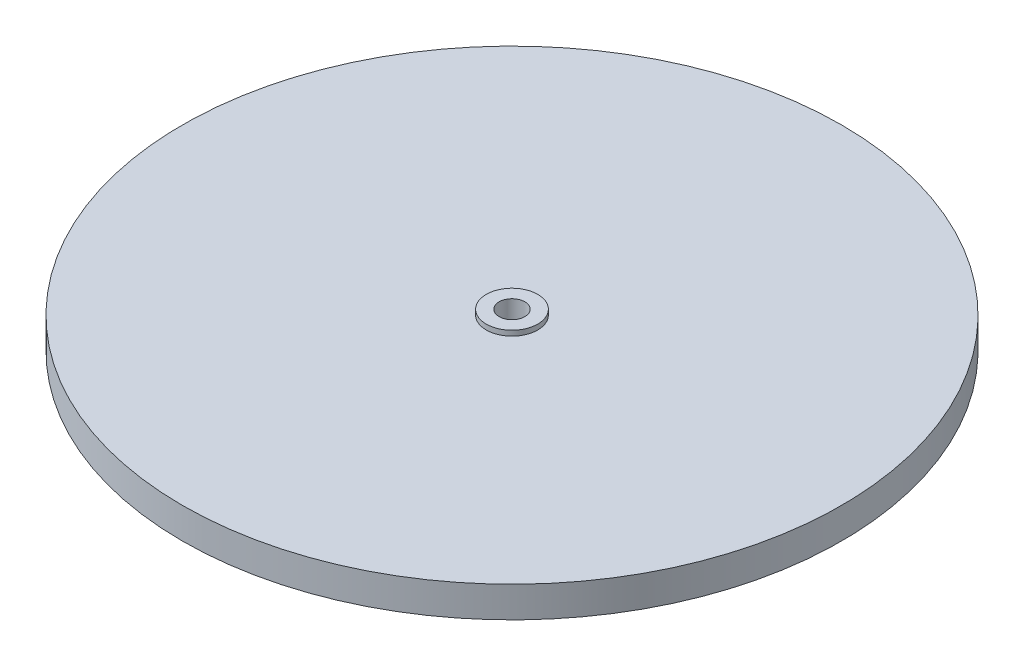
ISO-10303-21;
HEADER;
FILE_DESCRIPTION(('STEP AP214'),'2;1');
FILE_NAME('part.step','',(''),(''),'','','');
FILE_SCHEMA(('AUTOMOTIVE_DESIGN { 1 0 10303 214 1 1 1 1 }'));
ENDSEC;
DATA;
#1=APPLICATION_CONTEXT('core data for automotive mechanical design processes');
#2=APPLICATION_PROTOCOL_DEFINITION('international standard','automotive_design',2000,#1);
#3=PRODUCT_CONTEXT('',#1,'mechanical');
#4=PRODUCT('Part','Part','',(#3));
#5=PRODUCT_RELATED_PRODUCT_CATEGORY('part','',(#4));
#6=PRODUCT_DEFINITION_FORMATION('','',#4);
#7=PRODUCT_DEFINITION_CONTEXT('part definition',#1,'design');
#8=PRODUCT_DEFINITION('design','',#6,#7);
#9=PRODUCT_DEFINITION_SHAPE('','',#8);
#10=(LENGTH_UNIT() NAMED_UNIT(*) SI_UNIT(.MILLI.,.METRE.));
#11=(NAMED_UNIT(*) PLANE_ANGLE_UNIT() SI_UNIT($,.RADIAN.));
#12=(NAMED_UNIT(*) SI_UNIT($,.STERADIAN.) SOLID_ANGLE_UNIT());
#13=UNCERTAINTY_MEASURE_WITH_UNIT(LENGTH_MEASURE(1.E-05),#10,'distance_accuracy_value','');
#14=(GEOMETRIC_REPRESENTATION_CONTEXT(3) GLOBAL_UNCERTAINTY_ASSIGNED_CONTEXT((#13)) GLOBAL_UNIT_ASSIGNED_CONTEXT((#10,
#11,#12)) REPRESENTATION_CONTEXT('',''));
#15=CARTESIAN_POINT('',(0.,0.,0.));
#16=DIRECTION('',(0.,0.,1.));
#17=DIRECTION('',(1.,0.,0.));
#18=AXIS2_PLACEMENT_3D('',#15,#16,#17);
#19=CARTESIAN_POINT('',(0.,-3.,0.));
#20=DIRECTION('',(0.,1.,0.));
#21=DIRECTION('',(0.,0.,1.));
#22=AXIS2_PLACEMENT_3D('',#19,#20,#21);
#23=CYLINDRICAL_SURFACE('',#22,64.);
#24=CARTESIAN_POINT('',(0.,-3.,0.));
#25=DIRECTION('',(0.,1.,0.));
#26=DIRECTION('',(0.,0.,1.));
#27=AXIS2_PLACEMENT_3D('',#24,#25,#26);
#28=CIRCLE('',#27,64.);
#29=CARTESIAN_POINT('',(0.,-3.,64.));
#30=VERTEX_POINT('',#29);
#31=EDGE_CURVE('E42',#30,#30,#28,.T.);
#32=ORIENTED_EDGE('',*,*,#31,.T.);
#33=EDGE_LOOP('',(#32));
#34=FACE_BOUND('',#33,.T.);
#35=CARTESIAN_POINT('',(0.,3.,0.));
#36=DIRECTION('',(0.,1.,0.));
#37=DIRECTION('',(0.,0.,1.));
#38=AXIS2_PLACEMENT_3D('',#35,#36,#37);
#39=CIRCLE('',#38,64.);
#40=CARTESIAN_POINT('',(0.,3.,64.));
#41=VERTEX_POINT('',#40);
#42=EDGE_CURVE('E46',#41,#41,#39,.T.);
#43=ORIENTED_EDGE('',*,*,#42,.F.);
#44=EDGE_LOOP('',(#43));
#45=FACE_BOUND('',#44,.T.);
#46=ADVANCED_FACE('F36',(#34,#45),#23,.T.);
#47=CARTESIAN_POINT('',(0.,-3.,0.));
#48=DIRECTION('',(0.,1.,0.));
#49=DIRECTION('',(0.,0.,1.));
#50=AXIS2_PLACEMENT_3D('',#47,#48,#49);
#51=PLANE('',#50);
#52=CARTESIAN_POINT('',(0.,-3.,0.));
#53=DIRECTION('',(0.,1.,0.));
#54=DIRECTION('',(0.,0.,1.));
#55=AXIS2_PLACEMENT_3D('',#52,#53,#54);
#56=CIRCLE('',#55,5.);
#57=CARTESIAN_POINT('',(0.,-3.,5.));
#58=VERTEX_POINT('',#57);
#59=EDGE_CURVE('E50',#58,#58,#56,.T.);
#60=ORIENTED_EDGE('',*,*,#59,.T.);
#61=EDGE_LOOP('',(#60));
#62=FACE_BOUND('',#61,.T.);
#63=ORIENTED_EDGE('',*,*,#31,.F.);
#64=EDGE_LOOP('',(#63));
#65=FACE_BOUND('',#64,.T.);
#66=ADVANCED_FACE('F95',(#62,#65),#51,.F.);
#67=CARTESIAN_POINT('',(0.,3.,0.));
#68=DIRECTION('',(0.,1.,0.));
#69=DIRECTION('',(0.,0.,1.));
#70=AXIS2_PLACEMENT_3D('',#67,#68,#69);
#71=PLANE('',#70);
#72=CARTESIAN_POINT('',(0.,3.,0.));
#73=DIRECTION('',(0.,1.,0.));
#74=DIRECTION('',(0.,0.,1.));
#75=AXIS2_PLACEMENT_3D('',#72,#73,#74);
#76=CIRCLE('',#75,5.);
#77=CARTESIAN_POINT('',(0.,3.,5.));
#78=VERTEX_POINT('',#77);
#79=EDGE_CURVE('E10',#78,#78,#76,.T.);
#80=ORIENTED_EDGE('',*,*,#79,.F.);
#81=EDGE_LOOP('',(#80));
#82=FACE_BOUND('',#81,.T.);
#83=ORIENTED_EDGE('',*,*,#42,.T.);
#84=EDGE_LOOP('',(#83));
#85=FACE_BOUND('',#84,.T.);
#86=ADVANCED_FACE('F81',(#82,#85),#71,.T.);
#87=CARTESIAN_POINT('',(0.,4.,0.));
#88=DIRECTION('',(0.,1.,0.));
#89=DIRECTION('',(0.,0.,1.));
#90=AXIS2_PLACEMENT_3D('',#87,#88,#89);
#91=PLANE('',#90);
#92=CARTESIAN_POINT('',(0.,4.,0.));
#93=DIRECTION('',(0.,1.,0.));
#94=DIRECTION('',(0.,0.,1.));
#95=AXIS2_PLACEMENT_3D('',#92,#93,#94);
#96=CIRCLE('',#95,2.5);
#97=CARTESIAN_POINT('',(0.,4.,2.5));
#98=VERTEX_POINT('',#97);
#99=EDGE_CURVE('E62',#98,#98,#96,.T.);
#100=ORIENTED_EDGE('',*,*,#99,.F.);
#101=EDGE_LOOP('',(#100));
#102=FACE_BOUND('',#101,.T.);
#103=CARTESIAN_POINT('',(0.,4.,0.));
#104=DIRECTION('',(0.,1.,0.));
#105=DIRECTION('',(0.,0.,1.));
#106=AXIS2_PLACEMENT_3D('',#103,#104,#105);
#107=CIRCLE('',#106,5.);
#108=CARTESIAN_POINT('',(0.,4.,5.));
#109=VERTEX_POINT('',#108);
#110=EDGE_CURVE('E58',#109,#109,#107,.T.);
#111=ORIENTED_EDGE('',*,*,#110,.T.);
#112=EDGE_LOOP('',(#111));
#113=FACE_BOUND('',#112,.T.);
#114=ADVANCED_FACE('F77',(#102,#113),#91,.T.);
#115=CARTESIAN_POINT('',(0.,-7.,0.));
#116=DIRECTION('',(0.,1.,0.));
#117=DIRECTION('',(0.,0.,1.));
#118=AXIS2_PLACEMENT_3D('',#115,#116,#117);
#119=CYLINDRICAL_SURFACE('',#118,5.);
#120=ORIENTED_EDGE('',*,*,#79,.T.);
#121=EDGE_LOOP('',(#120));
#122=FACE_BOUND('',#121,.T.);
#123=ORIENTED_EDGE('',*,*,#110,.F.);
#124=EDGE_LOOP('',(#123));
#125=FACE_BOUND('',#124,.T.);
#126=ADVANCED_FACE('F80',(#122,#125),#119,.T.);
#127=CARTESIAN_POINT('',(0.,-7.,0.));
#128=DIRECTION('',(0.,1.,0.));
#129=DIRECTION('',(0.,0.,1.));
#130=AXIS2_PLACEMENT_3D('',#127,#128,#129);
#131=CIRCLE('',#130,5.);
#132=CARTESIAN_POINT('',(0.,-7.,5.));
#133=VERTEX_POINT('',#132);
#134=EDGE_CURVE('E55',#133,#133,#131,.T.);
#135=ORIENTED_EDGE('',*,*,#134,.T.);
#136=EDGE_LOOP('',(#135));
#137=FACE_BOUND('',#136,.T.);
#138=ORIENTED_EDGE('',*,*,#59,.F.);
#139=EDGE_LOOP('',(#138));
#140=FACE_BOUND('',#139,.T.);
#141=ADVANCED_FACE('F86',(#137,#140),#119,.T.);
#142=CARTESIAN_POINT('',(0.,-7.,0.));
#143=DIRECTION('',(0.,1.,0.));
#144=DIRECTION('',(0.,0.,1.));
#145=AXIS2_PLACEMENT_3D('',#142,#143,#144);
#146=PLANE('',#145);
#147=CARTESIAN_POINT('',(0.,-7.,0.));
#148=DIRECTION('',(0.,1.,0.));
#149=DIRECTION('',(0.,0.,1.));
#150=AXIS2_PLACEMENT_3D('',#147,#148,#149);
#151=CIRCLE('',#150,2.5);
#152=CARTESIAN_POINT('',(0.,-7.,2.5));
#153=VERTEX_POINT('',#152);
#154=EDGE_CURVE('E61',#153,#153,#151,.T.);
#155=ORIENTED_EDGE('',*,*,#154,.T.);
#156=EDGE_LOOP('',(#155));
#157=FACE_BOUND('',#156,.T.);
#158=ORIENTED_EDGE('',*,*,#134,.F.);
#159=EDGE_LOOP('',(#158));
#160=FACE_BOUND('',#159,.T.);
#161=ADVANCED_FACE('F68',(#157,#160),#146,.F.);
#162=CARTESIAN_POINT('',(0.,-7.,0.));
#163=DIRECTION('',(0.,1.,0.));
#164=DIRECTION('',(0.,0.,1.));
#165=AXIS2_PLACEMENT_3D('',#162,#163,#164);
#166=CYLINDRICAL_SURFACE('',#165,2.5);
#167=ORIENTED_EDGE('',*,*,#154,.F.);
#168=EDGE_LOOP('',(#167));
#169=FACE_BOUND('',#168,.T.);
#170=ORIENTED_EDGE('',*,*,#99,.T.);
#171=EDGE_LOOP('',(#170));
#172=FACE_BOUND('',#171,.T.);
#173=ADVANCED_FACE('F71',(#169,#172),#166,.F.);
#174=CLOSED_SHELL('',(#46,#66,#86,#114,#126,#141,#161,#173));
#175=MANIFOLD_SOLID_BREP('B2',#174);
#176=ADVANCED_BREP_SHAPE_REPRESENTATION('',(#18,#175),#14);
#177=SHAPE_DEFINITION_REPRESENTATION(#9,#176);
ENDSEC;
END-ISO-10303-21;
